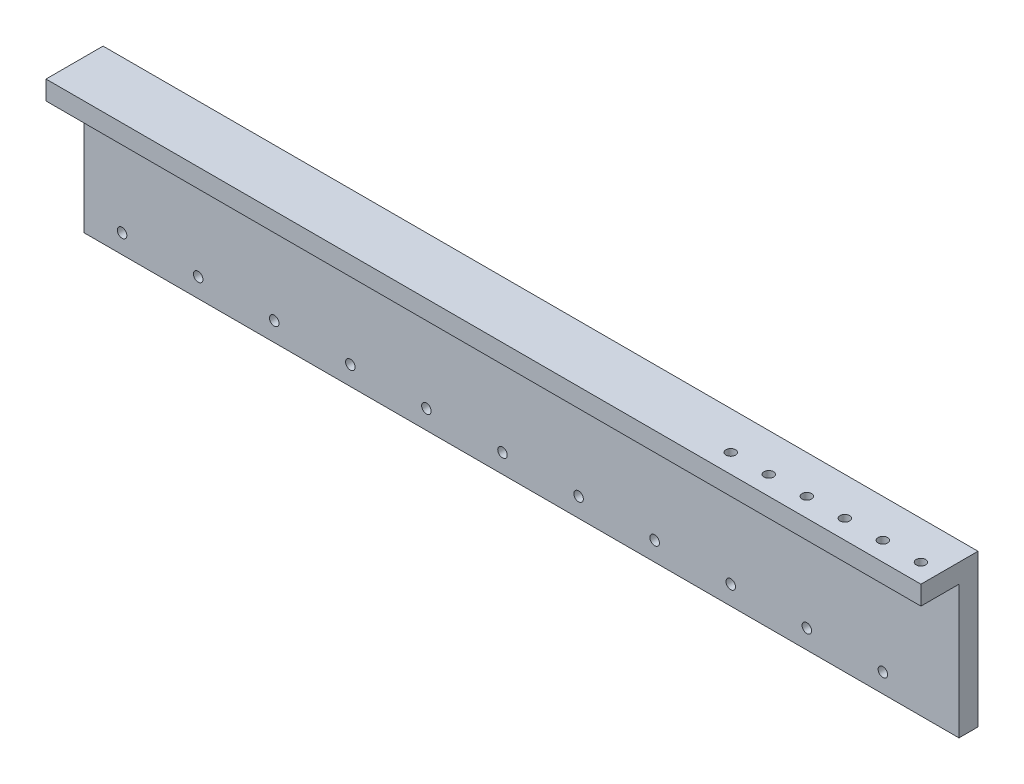
ISO-10303-21;
HEADER;
FILE_DESCRIPTION(('STEP AP214'),'2;1');
FILE_NAME('part.step','',(''),(''),'','','');
FILE_SCHEMA(('AUTOMOTIVE_DESIGN { 1 0 10303 214 1 1 1 1 }'));
ENDSEC;
DATA;
#1=APPLICATION_CONTEXT('core data for automotive mechanical design processes');
#2=APPLICATION_PROTOCOL_DEFINITION('international standard','automotive_design',2000,#1);
#3=PRODUCT_CONTEXT('',#1,'mechanical');
#4=PRODUCT('Part','Part','',(#3));
#5=PRODUCT_RELATED_PRODUCT_CATEGORY('part','',(#4));
#6=PRODUCT_DEFINITION_FORMATION('','',#4);
#7=PRODUCT_DEFINITION_CONTEXT('part definition',#1,'design');
#8=PRODUCT_DEFINITION('design','',#6,#7);
#9=PRODUCT_DEFINITION_SHAPE('','',#8);
#10=(LENGTH_UNIT() NAMED_UNIT(*) SI_UNIT(.MILLI.,.METRE.));
#11=(NAMED_UNIT(*) PLANE_ANGLE_UNIT() SI_UNIT($,.RADIAN.));
#12=(NAMED_UNIT(*) SI_UNIT($,.STERADIAN.) SOLID_ANGLE_UNIT());
#13=UNCERTAINTY_MEASURE_WITH_UNIT(LENGTH_MEASURE(1.E-05),#10,'distance_accuracy_value','');
#14=(GEOMETRIC_REPRESENTATION_CONTEXT(3) GLOBAL_UNCERTAINTY_ASSIGNED_CONTEXT((#13)) GLOBAL_UNIT_ASSIGNED_CONTEXT((#10,
#11,#12)) REPRESENTATION_CONTEXT('',''));
#15=CARTESIAN_POINT('',(0.,0.,0.));
#16=DIRECTION('',(0.,0.,1.));
#17=DIRECTION('',(1.,0.,0.));
#18=AXIS2_PLACEMENT_3D('',#15,#16,#17);
#19=CARTESIAN_POINT('',(0.,0.,5.));
#20=DIRECTION('',(0.,0.,-1.));
#21=DIRECTION('',(-1.,0.,0.));
#22=AXIS2_PLACEMENT_3D('',#19,#20,#21);
#23=PLANE('',#22);
#24=CARTESIAN_POINT('',(95.,-15.,5.));
#25=DIRECTION('',(0.,0.,1.));
#26=DIRECTION('',(1.,0.,0.));
#27=AXIS2_PLACEMENT_3D('',#24,#25,#26);
#28=CIRCLE('',#27,1.25);
#29=CARTESIAN_POINT('',(96.25,-15.,5.));
#30=VERTEX_POINT('',#29);
#31=EDGE_CURVE('E142',#30,#30,#28,.T.);
#32=ORIENTED_EDGE('',*,*,#31,.F.);
#33=EDGE_LOOP('',(#32));
#34=FACE_BOUND('',#33,.T.);
#35=CARTESIAN_POINT('',(75.,-15.,5.));
#36=DIRECTION('',(0.,0.,1.));
#37=DIRECTION('',(1.,0.,0.));
#38=AXIS2_PLACEMENT_3D('',#35,#36,#37);
#39=CIRCLE('',#38,1.25);
#40=CARTESIAN_POINT('',(76.25,-15.,5.));
#41=VERTEX_POINT('',#40);
#42=EDGE_CURVE('E148',#41,#41,#39,.T.);
#43=ORIENTED_EDGE('',*,*,#42,.F.);
#44=EDGE_LOOP('',(#43));
#45=FACE_BOUND('',#44,.T.);
#46=CARTESIAN_POINT('',(55.,-15.,5.));
#47=DIRECTION('',(0.,0.,1.));
#48=DIRECTION('',(1.,0.,0.));
#49=AXIS2_PLACEMENT_3D('',#46,#47,#48);
#50=CIRCLE('',#49,1.25);
#51=CARTESIAN_POINT('',(56.25,-15.,5.));
#52=VERTEX_POINT('',#51);
#53=EDGE_CURVE('E154',#52,#52,#50,.T.);
#54=ORIENTED_EDGE('',*,*,#53,.F.);
#55=EDGE_LOOP('',(#54));
#56=FACE_BOUND('',#55,.T.);
#57=CARTESIAN_POINT('',(35.,-15.,5.));
#58=DIRECTION('',(0.,0.,1.));
#59=DIRECTION('',(1.,0.,0.));
#60=AXIS2_PLACEMENT_3D('',#57,#58,#59);
#61=CIRCLE('',#60,1.25);
#62=CARTESIAN_POINT('',(36.25,-15.,5.));
#63=VERTEX_POINT('',#62);
#64=EDGE_CURVE('E160',#63,#63,#61,.T.);
#65=ORIENTED_EDGE('',*,*,#64,.F.);
#66=EDGE_LOOP('',(#65));
#67=FACE_BOUND('',#66,.T.);
#68=CARTESIAN_POINT('',(15.,-15.,5.));
#69=DIRECTION('',(0.,0.,1.));
#70=DIRECTION('',(1.,0.,0.));
#71=AXIS2_PLACEMENT_3D('',#68,#69,#70);
#72=CIRCLE('',#71,1.25);
#73=CARTESIAN_POINT('',(16.25,-15.,5.));
#74=VERTEX_POINT('',#73);
#75=EDGE_CURVE('E166',#74,#74,#72,.T.);
#76=ORIENTED_EDGE('',*,*,#75,.F.);
#77=EDGE_LOOP('',(#76));
#78=FACE_BOUND('',#77,.T.);
#79=CARTESIAN_POINT('',(-4.99999999999999,-15.,5.));
#80=DIRECTION('',(0.,0.,1.));
#81=DIRECTION('',(1.,0.,0.));
#82=AXIS2_PLACEMENT_3D('',#79,#80,#81);
#83=CIRCLE('',#82,1.25);
#84=CARTESIAN_POINT('',(-3.74999999999999,-15.,5.));
#85=VERTEX_POINT('',#84);
#86=EDGE_CURVE('E172',#85,#85,#83,.T.);
#87=ORIENTED_EDGE('',*,*,#86,.F.);
#88=EDGE_LOOP('',(#87));
#89=FACE_BOUND('',#88,.T.);
#90=CARTESIAN_POINT('',(-25.,-15.,5.));
#91=DIRECTION('',(0.,0.,1.));
#92=DIRECTION('',(1.,0.,0.));
#93=AXIS2_PLACEMENT_3D('',#90,#91,#92);
#94=CIRCLE('',#93,1.25);
#95=CARTESIAN_POINT('',(-23.75,-15.,5.));
#96=VERTEX_POINT('',#95);
#97=EDGE_CURVE('E178',#96,#96,#94,.T.);
#98=ORIENTED_EDGE('',*,*,#97,.F.);
#99=EDGE_LOOP('',(#98));
#100=FACE_BOUND('',#99,.T.);
#101=CARTESIAN_POINT('',(-45.,-15.,5.));
#102=DIRECTION('',(0.,0.,1.));
#103=DIRECTION('',(1.,0.,0.));
#104=AXIS2_PLACEMENT_3D('',#101,#102,#103);
#105=CIRCLE('',#104,1.25);
#106=CARTESIAN_POINT('',(-43.75,-15.,5.));
#107=VERTEX_POINT('',#106);
#108=EDGE_CURVE('E184',#107,#107,#105,.T.);
#109=ORIENTED_EDGE('',*,*,#108,.F.);
#110=EDGE_LOOP('',(#109));
#111=FACE_BOUND('',#110,.T.);
#112=CARTESIAN_POINT('',(-65.,-15.,5.));
#113=DIRECTION('',(0.,0.,1.));
#114=DIRECTION('',(1.,0.,0.));
#115=AXIS2_PLACEMENT_3D('',#112,#113,#114);
#116=CIRCLE('',#115,1.25000000000001);
#117=CARTESIAN_POINT('',(-63.75,-15.,5.));
#118=VERTEX_POINT('',#117);
#119=EDGE_CURVE('E190',#118,#118,#116,.T.);
#120=ORIENTED_EDGE('',*,*,#119,.F.);
#121=EDGE_LOOP('',(#120));
#122=FACE_BOUND('',#121,.T.);
#123=CARTESIAN_POINT('',(-85.,-15.,5.));
#124=DIRECTION('',(0.,0.,1.));
#125=DIRECTION('',(1.,0.,0.));
#126=AXIS2_PLACEMENT_3D('',#123,#124,#125);
#127=CIRCLE('',#126,1.25);
#128=CARTESIAN_POINT('',(-83.75,-15.,5.));
#129=VERTEX_POINT('',#128);
#130=EDGE_CURVE('E196',#129,#129,#127,.T.);
#131=ORIENTED_EDGE('',*,*,#130,.F.);
#132=EDGE_LOOP('',(#131));
#133=FACE_BOUND('',#132,.T.);
#134=CARTESIAN_POINT('',(-105.,-15.,5.));
#135=DIRECTION('',(0.,0.,1.));
#136=DIRECTION('',(1.,0.,0.));
#137=AXIS2_PLACEMENT_3D('',#134,#135,#136);
#138=CIRCLE('',#137,1.25);
#139=CARTESIAN_POINT('',(-103.75,-15.,5.));
#140=VERTEX_POINT('',#139);
#141=EDGE_CURVE('E97',#140,#140,#138,.T.);
#142=ORIENTED_EDGE('',*,*,#141,.F.);
#143=EDGE_LOOP('',(#142));
#144=FACE_BOUND('',#143,.T.);
#145=DIRECTION('',(1.,0.,0.));
#146=VECTOR('',#145,1.);
#147=CARTESIAN_POINT('',(-115.,15.,5.));
#148=LINE('',#147,#146);
#149=CARTESIAN_POINT('',(-115.,15.,5.));
#150=VERTEX_POINT('',#149);
#151=CARTESIAN_POINT('',(115.,15.,5.));
#152=VERTEX_POINT('',#151);
#153=EDGE_CURVE('E50',#150,#152,#148,.T.);
#154=ORIENTED_EDGE('',*,*,#153,.F.);
#155=DIRECTION('',(0.,-1.,0.));
#156=VECTOR('',#155,1.);
#157=CARTESIAN_POINT('',(-115.,-20.,5.));
#158=LINE('',#157,#156);
#159=CARTESIAN_POINT('',(-115.,-20.,5.));
#160=VERTEX_POINT('',#159);
#161=EDGE_CURVE('E203',#150,#160,#158,.T.);
#162=ORIENTED_EDGE('',*,*,#161,.T.);
#163=DIRECTION('',(1.,0.,0.));
#164=VECTOR('',#163,1.);
#165=CARTESIAN_POINT('',(-115.,-20.,5.));
#166=LINE('',#165,#164);
#167=CARTESIAN_POINT('',(115.,-20.,5.));
#168=VERTEX_POINT('',#167);
#169=EDGE_CURVE('E56',#160,#168,#166,.T.);
#170=ORIENTED_EDGE('',*,*,#169,.T.);
#171=DIRECTION('',(0.,1.,0.));
#172=VECTOR('',#171,1.);
#173=CARTESIAN_POINT('',(115.,-20.,5.));
#174=LINE('',#173,#172);
#175=EDGE_CURVE('E85',#168,#152,#174,.T.);
#176=ORIENTED_EDGE('',*,*,#175,.T.);
#177=EDGE_LOOP('',(#154,#162,#170,#176));
#178=FACE_BOUND('',#177,.T.);
#179=ADVANCED_FACE('F35',(#34,#45,#56,#67,#78,#89,#100,#111,#122,#133,#144,#178),#23,.F.);
#180=CARTESIAN_POINT('',(0.,0.,0.));
#181=DIRECTION('',(0.,0.,-1.));
#182=DIRECTION('',(-1.,0.,0.));
#183=AXIS2_PLACEMENT_3D('',#180,#181,#182);
#184=PLANE('',#183);
#185=CARTESIAN_POINT('',(75.,-15.,0.));
#186=DIRECTION('',(0.,0.,1.));
#187=DIRECTION('',(1.,0.,0.));
#188=AXIS2_PLACEMENT_3D('',#185,#186,#187);
#189=CIRCLE('',#188,1.25);
#190=CARTESIAN_POINT('',(76.25,-15.,0.));
#191=VERTEX_POINT('',#190);
#192=EDGE_CURVE('E145',#191,#191,#189,.T.);
#193=ORIENTED_EDGE('',*,*,#192,.T.);
#194=EDGE_LOOP('',(#193));
#195=FACE_BOUND('',#194,.T.);
#196=CARTESIAN_POINT('',(35.,-15.,0.));
#197=DIRECTION('',(0.,0.,1.));
#198=DIRECTION('',(1.,0.,0.));
#199=AXIS2_PLACEMENT_3D('',#196,#197,#198);
#200=CIRCLE('',#199,1.25);
#201=CARTESIAN_POINT('',(36.25,-15.,0.));
#202=VERTEX_POINT('',#201);
#203=EDGE_CURVE('E157',#202,#202,#200,.T.);
#204=ORIENTED_EDGE('',*,*,#203,.T.);
#205=EDGE_LOOP('',(#204));
#206=FACE_BOUND('',#205,.T.);
#207=CARTESIAN_POINT('',(-4.99999999999999,-15.,0.));
#208=DIRECTION('',(0.,0.,1.));
#209=DIRECTION('',(1.,0.,0.));
#210=AXIS2_PLACEMENT_3D('',#207,#208,#209);
#211=CIRCLE('',#210,1.25);
#212=CARTESIAN_POINT('',(-3.74999999999999,-15.,0.));
#213=VERTEX_POINT('',#212);
#214=EDGE_CURVE('E169',#213,#213,#211,.T.);
#215=ORIENTED_EDGE('',*,*,#214,.T.);
#216=EDGE_LOOP('',(#215));
#217=FACE_BOUND('',#216,.T.);
#218=CARTESIAN_POINT('',(-45.,-15.,0.));
#219=DIRECTION('',(0.,0.,1.));
#220=DIRECTION('',(1.,0.,0.));
#221=AXIS2_PLACEMENT_3D('',#218,#219,#220);
#222=CIRCLE('',#221,1.25);
#223=CARTESIAN_POINT('',(-43.75,-15.,0.));
#224=VERTEX_POINT('',#223);
#225=EDGE_CURVE('E181',#224,#224,#222,.T.);
#226=ORIENTED_EDGE('',*,*,#225,.T.);
#227=EDGE_LOOP('',(#226));
#228=FACE_BOUND('',#227,.T.);
#229=CARTESIAN_POINT('',(-85.,-15.,0.));
#230=DIRECTION('',(0.,0.,1.));
#231=DIRECTION('',(1.,0.,0.));
#232=AXIS2_PLACEMENT_3D('',#229,#230,#231);
#233=CIRCLE('',#232,1.25);
#234=CARTESIAN_POINT('',(-83.75,-15.,0.));
#235=VERTEX_POINT('',#234);
#236=EDGE_CURVE('E193',#235,#235,#233,.T.);
#237=ORIENTED_EDGE('',*,*,#236,.T.);
#238=EDGE_LOOP('',(#237));
#239=FACE_BOUND('',#238,.T.);
#240=DIRECTION('',(0.,1.,0.));
#241=VECTOR('',#240,1.);
#242=CARTESIAN_POINT('',(115.,-20.,0.));
#243=LINE('',#242,#241);
#244=CARTESIAN_POINT('',(115.,-20.,0.));
#245=VERTEX_POINT('',#244);
#246=CARTESIAN_POINT('',(115.,20.,0.));
#247=VERTEX_POINT('',#246);
#248=EDGE_CURVE('E91',#245,#247,#243,.T.);
#249=ORIENTED_EDGE('',*,*,#248,.F.);
#250=DIRECTION('',(1.,0.,0.));
#251=VECTOR('',#250,1.);
#252=CARTESIAN_POINT('',(-115.,-20.,0.));
#253=LINE('',#252,#251);
#254=CARTESIAN_POINT('',(-115.,-20.,0.));
#255=VERTEX_POINT('',#254);
#256=EDGE_CURVE('E75',#255,#245,#253,.T.);
#257=ORIENTED_EDGE('',*,*,#256,.F.);
#258=DIRECTION('',(0.,-1.,0.));
#259=VECTOR('',#258,1.);
#260=CARTESIAN_POINT('',(-115.,-20.,0.));
#261=LINE('',#260,#259);
#262=CARTESIAN_POINT('',(-115.,20.,0.));
#263=VERTEX_POINT('',#262);
#264=EDGE_CURVE('E86',#263,#255,#261,.T.);
#265=ORIENTED_EDGE('',*,*,#264,.F.);
#266=DIRECTION('',(-1.,0.,0.));
#267=VECTOR('',#266,1.);
#268=CARTESIAN_POINT('',(-115.,20.,0.));
#269=LINE('',#268,#267);
#270=EDGE_CURVE('E96',#247,#263,#269,.T.);
#271=ORIENTED_EDGE('',*,*,#270,.F.);
#272=EDGE_LOOP('',(#249,#257,#265,#271));
#273=FACE_BOUND('',#272,.T.);
#274=CARTESIAN_POINT('',(-105.,-15.,0.));
#275=DIRECTION('',(0.,0.,1.));
#276=DIRECTION('',(1.,0.,0.));
#277=AXIS2_PLACEMENT_3D('',#274,#275,#276);
#278=CIRCLE('',#277,1.25);
#279=CARTESIAN_POINT('',(-103.75,-15.,0.));
#280=VERTEX_POINT('',#279);
#281=EDGE_CURVE('E101',#280,#280,#278,.T.);
#282=ORIENTED_EDGE('',*,*,#281,.T.);
#283=EDGE_LOOP('',(#282));
#284=FACE_BOUND('',#283,.T.);
#285=CARTESIAN_POINT('',(-65.,-15.,0.));
#286=DIRECTION('',(0.,0.,1.));
#287=DIRECTION('',(1.,0.,0.));
#288=AXIS2_PLACEMENT_3D('',#285,#286,#287);
#289=CIRCLE('',#288,1.25000000000001);
#290=CARTESIAN_POINT('',(-63.75,-15.,0.));
#291=VERTEX_POINT('',#290);
#292=EDGE_CURVE('E187',#291,#291,#289,.T.);
#293=ORIENTED_EDGE('',*,*,#292,.T.);
#294=EDGE_LOOP('',(#293));
#295=FACE_BOUND('',#294,.T.);
#296=CARTESIAN_POINT('',(-25.,-15.,0.));
#297=DIRECTION('',(0.,0.,1.));
#298=DIRECTION('',(1.,0.,0.));
#299=AXIS2_PLACEMENT_3D('',#296,#297,#298);
#300=CIRCLE('',#299,1.25);
#301=CARTESIAN_POINT('',(-23.75,-15.,0.));
#302=VERTEX_POINT('',#301);
#303=EDGE_CURVE('E175',#302,#302,#300,.T.);
#304=ORIENTED_EDGE('',*,*,#303,.T.);
#305=EDGE_LOOP('',(#304));
#306=FACE_BOUND('',#305,.T.);
#307=CARTESIAN_POINT('',(15.,-15.,0.));
#308=DIRECTION('',(0.,0.,1.));
#309=DIRECTION('',(1.,0.,0.));
#310=AXIS2_PLACEMENT_3D('',#307,#308,#309);
#311=CIRCLE('',#310,1.25);
#312=CARTESIAN_POINT('',(16.25,-15.,0.));
#313=VERTEX_POINT('',#312);
#314=EDGE_CURVE('E163',#313,#313,#311,.T.);
#315=ORIENTED_EDGE('',*,*,#314,.T.);
#316=EDGE_LOOP('',(#315));
#317=FACE_BOUND('',#316,.T.);
#318=CARTESIAN_POINT('',(55.,-15.,0.));
#319=DIRECTION('',(0.,0.,1.));
#320=DIRECTION('',(1.,0.,0.));
#321=AXIS2_PLACEMENT_3D('',#318,#319,#320);
#322=CIRCLE('',#321,1.25);
#323=CARTESIAN_POINT('',(56.25,-15.,0.));
#324=VERTEX_POINT('',#323);
#325=EDGE_CURVE('E151',#324,#324,#322,.T.);
#326=ORIENTED_EDGE('',*,*,#325,.T.);
#327=EDGE_LOOP('',(#326));
#328=FACE_BOUND('',#327,.T.);
#329=CARTESIAN_POINT('',(95.,-15.,0.));
#330=DIRECTION('',(0.,0.,1.));
#331=DIRECTION('',(1.,0.,0.));
#332=AXIS2_PLACEMENT_3D('',#329,#330,#331);
#333=CIRCLE('',#332,1.25);
#334=CARTESIAN_POINT('',(96.25,-15.,0.));
#335=VERTEX_POINT('',#334);
#336=EDGE_CURVE('E141',#335,#335,#333,.T.);
#337=ORIENTED_EDGE('',*,*,#336,.T.);
#338=EDGE_LOOP('',(#337));
#339=FACE_BOUND('',#338,.T.);
#340=ADVANCED_FACE('F94',(#195,#206,#217,#228,#239,#273,#284,#295,#306,#317,#328,#339),#184,.T.);
#341=CARTESIAN_POINT('',(115.,-20.,5.));
#342=DIRECTION('',(-1.,0.,0.));
#343=DIRECTION('',(0.,0.,1.));
#344=AXIS2_PLACEMENT_3D('',#341,#342,#343);
#345=PLANE('',#344);
#346=ORIENTED_EDGE('',*,*,#248,.T.);
#347=DIRECTION('',(0.,0.,-1.));
#348=VECTOR('',#347,1.);
#349=CARTESIAN_POINT('',(115.,20.,5.));
#350=LINE('',#349,#348);
#351=CARTESIAN_POINT('',(115.,20.,15.));
#352=VERTEX_POINT('',#351);
#353=EDGE_CURVE('E11',#352,#247,#350,.T.);
#354=ORIENTED_EDGE('',*,*,#353,.F.);
#355=DIRECTION('',(0.,1.,0.));
#356=VECTOR('',#355,1.);
#357=CARTESIAN_POINT('',(115.,20.,15.));
#358=LINE('',#357,#356);
#359=CARTESIAN_POINT('',(115.,15.,15.));
#360=VERTEX_POINT('',#359);
#361=EDGE_CURVE('E128',#360,#352,#358,.T.);
#362=ORIENTED_EDGE('',*,*,#361,.F.);
#363=DIRECTION('',(0.,0.,-1.));
#364=VECTOR('',#363,1.);
#365=CARTESIAN_POINT('',(115.,15.,15.));
#366=LINE('',#365,#364);
#367=EDGE_CURVE('E129',#360,#152,#366,.T.);
#368=ORIENTED_EDGE('',*,*,#367,.T.);
#369=ORIENTED_EDGE('',*,*,#175,.F.);
#370=DIRECTION('',(0.,0.,-1.));
#371=VECTOR('',#370,1.);
#372=CARTESIAN_POINT('',(115.,-20.,5.));
#373=LINE('',#372,#371);
#374=EDGE_CURVE('E78',#168,#245,#373,.T.);
#375=ORIENTED_EDGE('',*,*,#374,.T.);
#376=EDGE_LOOP('',(#346,#354,#362,#368,#369,#375));
#377=FACE_BOUND('',#376,.T.);
#378=ADVANCED_FACE('F37',(#377),#345,.F.);
#379=CARTESIAN_POINT('',(-115.,20.,5.));
#380=DIRECTION('',(0.,-1.,0.));
#381=DIRECTION('',(0.,0.,-1.));
#382=AXIS2_PLACEMENT_3D('',#379,#380,#381);
#383=PLANE('',#382);
#384=CARTESIAN_POINT('',(110.,20.,10.));
#385=DIRECTION('',(0.,1.,0.));
#386=DIRECTION('',(0.,0.,1.));
#387=AXIS2_PLACEMENT_3D('',#384,#385,#386);
#388=CIRCLE('',#387,1.25);
#389=CARTESIAN_POINT('',(110.,20.,11.25));
#390=VERTEX_POINT('',#389);
#391=EDGE_CURVE('E241',#390,#390,#388,.T.);
#392=ORIENTED_EDGE('',*,*,#391,.F.);
#393=EDGE_LOOP('',(#392));
#394=FACE_BOUND('',#393,.T.);
#395=CARTESIAN_POINT('',(100.,20.,10.0000000000001));
#396=DIRECTION('',(0.,1.,0.));
#397=DIRECTION('',(0.,0.,1.));
#398=AXIS2_PLACEMENT_3D('',#395,#396,#397);
#399=CIRCLE('',#398,1.25);
#400=CARTESIAN_POINT('',(100.,20.,11.2500000000001));
#401=VERTEX_POINT('',#400);
#402=EDGE_CURVE('E235',#401,#401,#399,.T.);
#403=ORIENTED_EDGE('',*,*,#402,.F.);
#404=EDGE_LOOP('',(#403));
#405=FACE_BOUND('',#404,.T.);
#406=CARTESIAN_POINT('',(90.,20.,10.0000000000001));
#407=DIRECTION('',(0.,1.,0.));
#408=DIRECTION('',(0.,0.,1.));
#409=AXIS2_PLACEMENT_3D('',#406,#407,#408);
#410=CIRCLE('',#409,1.25);
#411=CARTESIAN_POINT('',(90.,20.,11.2500000000001));
#412=VERTEX_POINT('',#411);
#413=EDGE_CURVE('E229',#412,#412,#410,.T.);
#414=ORIENTED_EDGE('',*,*,#413,.F.);
#415=EDGE_LOOP('',(#414));
#416=FACE_BOUND('',#415,.T.);
#417=CARTESIAN_POINT('',(80.,20.,10.0000000000002));
#418=DIRECTION('',(0.,1.,0.));
#419=DIRECTION('',(0.,0.,1.));
#420=AXIS2_PLACEMENT_3D('',#417,#418,#419);
#421=CIRCLE('',#420,1.25);
#422=CARTESIAN_POINT('',(80.,20.,11.2500000000002));
#423=VERTEX_POINT('',#422);
#424=EDGE_CURVE('E223',#423,#423,#421,.T.);
#425=ORIENTED_EDGE('',*,*,#424,.F.);
#426=EDGE_LOOP('',(#425));
#427=FACE_BOUND('',#426,.T.);
#428=CARTESIAN_POINT('',(70.,20.,10.0000000000003));
#429=DIRECTION('',(0.,1.,0.));
#430=DIRECTION('',(0.,0.,1.));
#431=AXIS2_PLACEMENT_3D('',#428,#429,#430);
#432=CIRCLE('',#431,1.25000000000001);
#433=CARTESIAN_POINT('',(70.,20.,11.2500000000003));
#434=VERTEX_POINT('',#433);
#435=EDGE_CURVE('E216',#434,#434,#432,.T.);
#436=ORIENTED_EDGE('',*,*,#435,.F.);
#437=EDGE_LOOP('',(#436));
#438=FACE_BOUND('',#437,.T.);
#439=CARTESIAN_POINT('',(60.,20.,10.0000000000003));
#440=DIRECTION('',(0.,1.,0.));
#441=DIRECTION('',(0.,0.,1.));
#442=AXIS2_PLACEMENT_3D('',#439,#440,#441);
#443=CIRCLE('',#442,1.25);
#444=CARTESIAN_POINT('',(60.,20.,11.2500000000003));
#445=VERTEX_POINT('',#444);
#446=EDGE_CURVE('E217',#445,#445,#443,.T.);
#447=ORIENTED_EDGE('',*,*,#446,.F.);
#448=EDGE_LOOP('',(#447));
#449=FACE_BOUND('',#448,.T.);
#450=ORIENTED_EDGE('',*,*,#270,.T.);
#451=DIRECTION('',(0.,0.,-1.));
#452=VECTOR('',#451,1.);
#453=CARTESIAN_POINT('',(-115.,20.,5.));
#454=LINE('',#453,#452);
#455=CARTESIAN_POINT('',(-115.,20.,15.));
#456=VERTEX_POINT('',#455);
#457=EDGE_CURVE('E43',#456,#263,#454,.T.);
#458=ORIENTED_EDGE('',*,*,#457,.F.);
#459=DIRECTION('',(-1.,0.,0.));
#460=VECTOR('',#459,1.);
#461=CARTESIAN_POINT('',(-115.,20.,15.));
#462=LINE('',#461,#460);
#463=EDGE_CURVE('E120',#352,#456,#462,.T.);
#464=ORIENTED_EDGE('',*,*,#463,.F.);
#465=ORIENTED_EDGE('',*,*,#353,.T.);
#466=EDGE_LOOP('',(#450,#458,#464,#465));
#467=FACE_BOUND('',#466,.T.);
#468=ADVANCED_FACE('F118',(#394,#405,#416,#427,#438,#449,#467),#383,.F.);
#469=CARTESIAN_POINT('',(-115.,-20.,5.));
#470=DIRECTION('',(1.,0.,0.));
#471=DIRECTION('',(0.,0.,-1.));
#472=AXIS2_PLACEMENT_3D('',#469,#470,#471);
#473=PLANE('',#472);
#474=ORIENTED_EDGE('',*,*,#264,.T.);
#475=DIRECTION('',(0.,0.,-1.));
#476=VECTOR('',#475,1.);
#477=CARTESIAN_POINT('',(-115.,-20.,5.));
#478=LINE('',#477,#476);
#479=EDGE_CURVE('E81',#160,#255,#478,.T.);
#480=ORIENTED_EDGE('',*,*,#479,.F.);
#481=ORIENTED_EDGE('',*,*,#161,.F.);
#482=DIRECTION('',(0.,0.,-1.));
#483=VECTOR('',#482,1.);
#484=CARTESIAN_POINT('',(-115.,15.,15.));
#485=LINE('',#484,#483);
#486=CARTESIAN_POINT('',(-115.,15.,15.));
#487=VERTEX_POINT('',#486);
#488=EDGE_CURVE('E131',#487,#150,#485,.T.);
#489=ORIENTED_EDGE('',*,*,#488,.F.);
#490=DIRECTION('',(0.,-1.,0.));
#491=VECTOR('',#490,1.);
#492=CARTESIAN_POINT('',(-115.,20.,15.));
#493=LINE('',#492,#491);
#494=EDGE_CURVE('E114',#456,#487,#493,.T.);
#495=ORIENTED_EDGE('',*,*,#494,.F.);
#496=ORIENTED_EDGE('',*,*,#457,.T.);
#497=EDGE_LOOP('',(#474,#480,#481,#489,#495,#496));
#498=FACE_BOUND('',#497,.T.);
#499=ADVANCED_FACE('F111',(#498),#473,.F.);
#500=CARTESIAN_POINT('',(-115.,-20.,5.));
#501=DIRECTION('',(0.,1.,0.));
#502=DIRECTION('',(0.,0.,1.));
#503=AXIS2_PLACEMENT_3D('',#500,#501,#502);
#504=PLANE('',#503);
#505=ORIENTED_EDGE('',*,*,#256,.T.);
#506=ORIENTED_EDGE('',*,*,#374,.F.);
#507=ORIENTED_EDGE('',*,*,#169,.F.);
#508=ORIENTED_EDGE('',*,*,#479,.T.);
#509=EDGE_LOOP('',(#505,#506,#507,#508));
#510=FACE_BOUND('',#509,.T.);
#511=ADVANCED_FACE('F77',(#510),#504,.F.);
#512=CARTESIAN_POINT('',(-105.,-15.,5.));
#513=DIRECTION('',(0.,0.,-1.));
#514=DIRECTION('',(-1.,0.,0.));
#515=AXIS2_PLACEMENT_3D('',#512,#513,#514);
#516=CYLINDRICAL_SURFACE('',#515,1.25);
#517=ORIENTED_EDGE('',*,*,#141,.T.);
#518=EDGE_LOOP('',(#517));
#519=FACE_BOUND('',#518,.T.);
#520=ORIENTED_EDGE('',*,*,#281,.F.);
#521=EDGE_LOOP('',(#520));
#522=FACE_BOUND('',#521,.T.);
#523=ADVANCED_FACE('F296',(#519,#522),#516,.F.);
#524=CARTESIAN_POINT('',(-85.,-15.,5.));
#525=DIRECTION('',(0.,0.,-1.));
#526=DIRECTION('',(-1.,0.,0.));
#527=AXIS2_PLACEMENT_3D('',#524,#525,#526);
#528=CYLINDRICAL_SURFACE('',#527,1.25);
#529=ORIENTED_EDGE('',*,*,#130,.T.);
#530=EDGE_LOOP('',(#529));
#531=FACE_BOUND('',#530,.T.);
#532=ORIENTED_EDGE('',*,*,#236,.F.);
#533=EDGE_LOOP('',(#532));
#534=FACE_BOUND('',#533,.T.);
#535=ADVANCED_FACE('F320',(#531,#534),#528,.F.);
#536=CARTESIAN_POINT('',(-65.,-15.,5.));
#537=DIRECTION('',(0.,0.,-1.));
#538=DIRECTION('',(-1.,0.,0.));
#539=AXIS2_PLACEMENT_3D('',#536,#537,#538);
#540=CYLINDRICAL_SURFACE('',#539,1.25000000000001);
#541=ORIENTED_EDGE('',*,*,#119,.T.);
#542=EDGE_LOOP('',(#541));
#543=FACE_BOUND('',#542,.T.);
#544=ORIENTED_EDGE('',*,*,#292,.F.);
#545=EDGE_LOOP('',(#544));
#546=FACE_BOUND('',#545,.T.);
#547=ADVANCED_FACE('F327',(#543,#546),#540,.F.);
#548=CARTESIAN_POINT('',(-45.,-15.,5.));
#549=DIRECTION('',(0.,0.,-1.));
#550=DIRECTION('',(-1.,0.,0.));
#551=AXIS2_PLACEMENT_3D('',#548,#549,#550);
#552=CYLINDRICAL_SURFACE('',#551,1.25);
#553=ORIENTED_EDGE('',*,*,#108,.T.);
#554=EDGE_LOOP('',(#553));
#555=FACE_BOUND('',#554,.T.);
#556=ORIENTED_EDGE('',*,*,#225,.F.);
#557=EDGE_LOOP('',(#556));
#558=FACE_BOUND('',#557,.T.);
#559=ADVANCED_FACE('F334',(#555,#558),#552,.F.);
#560=CARTESIAN_POINT('',(-25.,-15.,5.));
#561=DIRECTION('',(0.,0.,-1.));
#562=DIRECTION('',(-1.,0.,0.));
#563=AXIS2_PLACEMENT_3D('',#560,#561,#562);
#564=CYLINDRICAL_SURFACE('',#563,1.25);
#565=ORIENTED_EDGE('',*,*,#97,.T.);
#566=EDGE_LOOP('',(#565));
#567=FACE_BOUND('',#566,.T.);
#568=ORIENTED_EDGE('',*,*,#303,.F.);
#569=EDGE_LOOP('',(#568));
#570=FACE_BOUND('',#569,.T.);
#571=ADVANCED_FACE('F342',(#567,#570),#564,.F.);
#572=CARTESIAN_POINT('',(-4.99999999999999,-15.,5.));
#573=DIRECTION('',(0.,0.,-1.));
#574=DIRECTION('',(-1.,0.,0.));
#575=AXIS2_PLACEMENT_3D('',#572,#573,#574);
#576=CYLINDRICAL_SURFACE('',#575,1.25);
#577=ORIENTED_EDGE('',*,*,#86,.T.);
#578=EDGE_LOOP('',(#577));
#579=FACE_BOUND('',#578,.T.);
#580=ORIENTED_EDGE('',*,*,#214,.F.);
#581=EDGE_LOOP('',(#580));
#582=FACE_BOUND('',#581,.T.);
#583=ADVANCED_FACE('F350',(#579,#582),#576,.F.);
#584=CARTESIAN_POINT('',(15.,-15.,5.));
#585=DIRECTION('',(0.,0.,-1.));
#586=DIRECTION('',(-1.,0.,0.));
#587=AXIS2_PLACEMENT_3D('',#584,#585,#586);
#588=CYLINDRICAL_SURFACE('',#587,1.25);
#589=ORIENTED_EDGE('',*,*,#75,.T.);
#590=EDGE_LOOP('',(#589));
#591=FACE_BOUND('',#590,.T.);
#592=ORIENTED_EDGE('',*,*,#314,.F.);
#593=EDGE_LOOP('',(#592));
#594=FACE_BOUND('',#593,.T.);
#595=ADVANCED_FACE('F358',(#591,#594),#588,.F.);
#596=CARTESIAN_POINT('',(35.,-15.,5.));
#597=DIRECTION('',(0.,0.,-1.));
#598=DIRECTION('',(-1.,0.,0.));
#599=AXIS2_PLACEMENT_3D('',#596,#597,#598);
#600=CYLINDRICAL_SURFACE('',#599,1.25);
#601=ORIENTED_EDGE('',*,*,#64,.T.);
#602=EDGE_LOOP('',(#601));
#603=FACE_BOUND('',#602,.T.);
#604=ORIENTED_EDGE('',*,*,#203,.F.);
#605=EDGE_LOOP('',(#604));
#606=FACE_BOUND('',#605,.T.);
#607=ADVANCED_FACE('F366',(#603,#606),#600,.F.);
#608=CARTESIAN_POINT('',(55.,-15.,5.));
#609=DIRECTION('',(0.,0.,-1.));
#610=DIRECTION('',(-1.,0.,0.));
#611=AXIS2_PLACEMENT_3D('',#608,#609,#610);
#612=CYLINDRICAL_SURFACE('',#611,1.25);
#613=ORIENTED_EDGE('',*,*,#53,.T.);
#614=EDGE_LOOP('',(#613));
#615=FACE_BOUND('',#614,.T.);
#616=ORIENTED_EDGE('',*,*,#325,.F.);
#617=EDGE_LOOP('',(#616));
#618=FACE_BOUND('',#617,.T.);
#619=ADVANCED_FACE('F374',(#615,#618),#612,.F.);
#620=CARTESIAN_POINT('',(75.,-15.,5.));
#621=DIRECTION('',(0.,0.,-1.));
#622=DIRECTION('',(-1.,0.,0.));
#623=AXIS2_PLACEMENT_3D('',#620,#621,#622);
#624=CYLINDRICAL_SURFACE('',#623,1.25);
#625=ORIENTED_EDGE('',*,*,#42,.T.);
#626=EDGE_LOOP('',(#625));
#627=FACE_BOUND('',#626,.T.);
#628=ORIENTED_EDGE('',*,*,#192,.F.);
#629=EDGE_LOOP('',(#628));
#630=FACE_BOUND('',#629,.T.);
#631=ADVANCED_FACE('F280',(#627,#630),#624,.F.);
#632=CARTESIAN_POINT('',(95.,-15.,5.));
#633=DIRECTION('',(0.,0.,-1.));
#634=DIRECTION('',(-1.,0.,0.));
#635=AXIS2_PLACEMENT_3D('',#632,#633,#634);
#636=CYLINDRICAL_SURFACE('',#635,1.25);
#637=ORIENTED_EDGE('',*,*,#31,.T.);
#638=EDGE_LOOP('',(#637));
#639=FACE_BOUND('',#638,.T.);
#640=ORIENTED_EDGE('',*,*,#336,.F.);
#641=EDGE_LOOP('',(#640));
#642=FACE_BOUND('',#641,.T.);
#643=ADVANCED_FACE('F272',(#639,#642),#636,.F.);
#644=CARTESIAN_POINT('',(-115.,15.,15.));
#645=DIRECTION('',(0.,1.,0.));
#646=DIRECTION('',(-1.,0.,0.));
#647=AXIS2_PLACEMENT_3D('',#644,#645,#646);
#648=PLANE('',#647);
#649=CARTESIAN_POINT('',(110.,15.,10.));
#650=DIRECTION('',(0.,1.,0.));
#651=DIRECTION('',(-1.,0.,0.));
#652=AXIS2_PLACEMENT_3D('',#649,#650,#651);
#653=CIRCLE('',#652,1.25);
#654=CARTESIAN_POINT('',(108.75,15.,10.));
#655=VERTEX_POINT('',#654);
#656=EDGE_CURVE('E137',#655,#655,#653,.F.);
#657=ORIENTED_EDGE('',*,*,#656,.F.);
#658=EDGE_LOOP('',(#657));
#659=FACE_BOUND('',#658,.T.);
#660=CARTESIAN_POINT('',(100.,15.,10.0000000000001));
#661=DIRECTION('',(0.,1.,0.));
#662=DIRECTION('',(-1.,0.,0.));
#663=AXIS2_PLACEMENT_3D('',#660,#661,#662);
#664=CIRCLE('',#663,1.25);
#665=CARTESIAN_POINT('',(98.75,15.,10.0000000000001));
#666=VERTEX_POINT('',#665);
#667=EDGE_CURVE('E238',#666,#666,#664,.F.);
#668=ORIENTED_EDGE('',*,*,#667,.F.);
#669=EDGE_LOOP('',(#668));
#670=FACE_BOUND('',#669,.T.);
#671=CARTESIAN_POINT('',(90.,15.,10.0000000000001));
#672=DIRECTION('',(0.,1.,0.));
#673=DIRECTION('',(-1.,0.,0.));
#674=AXIS2_PLACEMENT_3D('',#671,#672,#673);
#675=CIRCLE('',#674,1.25);
#676=CARTESIAN_POINT('',(88.75,15.,10.0000000000001));
#677=VERTEX_POINT('',#676);
#678=EDGE_CURVE('E232',#677,#677,#675,.F.);
#679=ORIENTED_EDGE('',*,*,#678,.F.);
#680=EDGE_LOOP('',(#679));
#681=FACE_BOUND('',#680,.T.);
#682=CARTESIAN_POINT('',(80.,15.,10.0000000000002));
#683=DIRECTION('',(0.,1.,0.));
#684=DIRECTION('',(-1.,0.,0.));
#685=AXIS2_PLACEMENT_3D('',#682,#683,#684);
#686=CIRCLE('',#685,1.25);
#687=CARTESIAN_POINT('',(78.75,15.,10.0000000000002));
#688=VERTEX_POINT('',#687);
#689=EDGE_CURVE('E226',#688,#688,#686,.F.);
#690=ORIENTED_EDGE('',*,*,#689,.F.);
#691=EDGE_LOOP('',(#690));
#692=FACE_BOUND('',#691,.T.);
#693=CARTESIAN_POINT('',(70.,15.,10.0000000000003));
#694=DIRECTION('',(0.,1.,0.));
#695=DIRECTION('',(-1.,0.,0.));
#696=AXIS2_PLACEMENT_3D('',#693,#694,#695);
#697=CIRCLE('',#696,1.25000000000001);
#698=CARTESIAN_POINT('',(68.75,15.,10.0000000000003));
#699=VERTEX_POINT('',#698);
#700=EDGE_CURVE('E220',#699,#699,#697,.F.);
#701=ORIENTED_EDGE('',*,*,#700,.F.);
#702=EDGE_LOOP('',(#701));
#703=FACE_BOUND('',#702,.T.);
#704=CARTESIAN_POINT('',(60.,15.,10.0000000000003));
#705=DIRECTION('',(0.,1.,0.));
#706=DIRECTION('',(-1.,0.,0.));
#707=AXIS2_PLACEMENT_3D('',#704,#705,#706);
#708=CIRCLE('',#707,1.25);
#709=CARTESIAN_POINT('',(58.75,15.,10.0000000000003));
#710=VERTEX_POINT('',#709);
#711=EDGE_CURVE('E213',#710,#710,#708,.F.);
#712=ORIENTED_EDGE('',*,*,#711,.F.);
#713=EDGE_LOOP('',(#712));
#714=FACE_BOUND('',#713,.T.);
#715=ORIENTED_EDGE('',*,*,#153,.T.);
#716=ORIENTED_EDGE('',*,*,#367,.F.);
#717=DIRECTION('',(1.,0.,0.));
#718=VECTOR('',#717,1.);
#719=CARTESIAN_POINT('',(-115.,15.,15.));
#720=LINE('',#719,#718);
#721=EDGE_CURVE('E133',#487,#360,#720,.T.);
#722=ORIENTED_EDGE('',*,*,#721,.F.);
#723=ORIENTED_EDGE('',*,*,#488,.T.);
#724=EDGE_LOOP('',(#715,#716,#722,#723));
#725=FACE_BOUND('',#724,.T.);
#726=ADVANCED_FACE('F206',(#659,#670,#681,#692,#703,#714,#725),#648,.F.);
#727=CARTESIAN_POINT('',(0.,0.,15.));
#728=DIRECTION('',(0.,0.,1.));
#729=DIRECTION('',(1.,0.,0.));
#730=AXIS2_PLACEMENT_3D('',#727,#728,#729);
#731=PLANE('',#730);
#732=ORIENTED_EDGE('',*,*,#494,.T.);
#733=ORIENTED_EDGE('',*,*,#721,.T.);
#734=ORIENTED_EDGE('',*,*,#361,.T.);
#735=ORIENTED_EDGE('',*,*,#463,.T.);
#736=EDGE_LOOP('',(#732,#733,#734,#735));
#737=FACE_BOUND('',#736,.T.);
#738=ADVANCED_FACE('F124',(#737),#731,.T.);
#739=CARTESIAN_POINT('',(60.,-20.001,10.0000000000003));
#740=DIRECTION('',(0.,1.,0.));
#741=DIRECTION('',(0.,0.,1.));
#742=AXIS2_PLACEMENT_3D('',#739,#740,#741);
#743=CYLINDRICAL_SURFACE('',#742,1.25);
#744=ORIENTED_EDGE('',*,*,#446,.T.);
#745=EDGE_LOOP('',(#744));
#746=FACE_BOUND('',#745,.T.);
#747=ORIENTED_EDGE('',*,*,#711,.T.);
#748=EDGE_LOOP('',(#747));
#749=FACE_BOUND('',#748,.T.);
#750=ADVANCED_FACE('F264',(#746,#749),#743,.F.);
#751=CARTESIAN_POINT('',(70.,-20.001,10.0000000000003));
#752=DIRECTION('',(0.,1.,0.));
#753=DIRECTION('',(0.,0.,1.));
#754=AXIS2_PLACEMENT_3D('',#751,#752,#753);
#755=CYLINDRICAL_SURFACE('',#754,1.25000000000001);
#756=ORIENTED_EDGE('',*,*,#435,.T.);
#757=EDGE_LOOP('',(#756));
#758=FACE_BOUND('',#757,.T.);
#759=ORIENTED_EDGE('',*,*,#700,.T.);
#760=EDGE_LOOP('',(#759));
#761=FACE_BOUND('',#760,.T.);
#762=ADVANCED_FACE('F267',(#758,#761),#755,.F.);
#763=CARTESIAN_POINT('',(80.,-20.001,10.0000000000002));
#764=DIRECTION('',(0.,1.,0.));
#765=DIRECTION('',(0.,0.,1.));
#766=AXIS2_PLACEMENT_3D('',#763,#764,#765);
#767=CYLINDRICAL_SURFACE('',#766,1.25);
#768=ORIENTED_EDGE('',*,*,#424,.T.);
#769=EDGE_LOOP('',(#768));
#770=FACE_BOUND('',#769,.T.);
#771=ORIENTED_EDGE('',*,*,#689,.T.);
#772=EDGE_LOOP('',(#771));
#773=FACE_BOUND('',#772,.T.);
#774=ADVANCED_FACE('F467',(#770,#773),#767,.F.);
#775=CARTESIAN_POINT('',(90.,-20.001,10.0000000000001));
#776=DIRECTION('',(0.,1.,0.));
#777=DIRECTION('',(0.,0.,1.));
#778=AXIS2_PLACEMENT_3D('',#775,#776,#777);
#779=CYLINDRICAL_SURFACE('',#778,1.25);
#780=ORIENTED_EDGE('',*,*,#413,.T.);
#781=EDGE_LOOP('',(#780));
#782=FACE_BOUND('',#781,.T.);
#783=ORIENTED_EDGE('',*,*,#678,.T.);
#784=EDGE_LOOP('',(#783));
#785=FACE_BOUND('',#784,.T.);
#786=ADVANCED_FACE('F476',(#782,#785),#779,.F.);
#787=CARTESIAN_POINT('',(100.,-20.001,10.0000000000001));
#788=DIRECTION('',(0.,1.,0.));
#789=DIRECTION('',(0.,0.,1.));
#790=AXIS2_PLACEMENT_3D('',#787,#788,#789);
#791=CYLINDRICAL_SURFACE('',#790,1.25);
#792=ORIENTED_EDGE('',*,*,#402,.T.);
#793=EDGE_LOOP('',(#792));
#794=FACE_BOUND('',#793,.T.);
#795=ORIENTED_EDGE('',*,*,#667,.T.);
#796=EDGE_LOOP('',(#795));
#797=FACE_BOUND('',#796,.T.);
#798=ADVANCED_FACE('F485',(#794,#797),#791,.F.);
#799=CARTESIAN_POINT('',(110.,-20.001,10.));
#800=DIRECTION('',(0.,1.,0.));
#801=DIRECTION('',(0.,0.,1.));
#802=AXIS2_PLACEMENT_3D('',#799,#800,#801);
#803=CYLINDRICAL_SURFACE('',#802,1.25);
#804=ORIENTED_EDGE('',*,*,#391,.T.);
#805=EDGE_LOOP('',(#804));
#806=FACE_BOUND('',#805,.T.);
#807=ORIENTED_EDGE('',*,*,#656,.T.);
#808=EDGE_LOOP('',(#807));
#809=FACE_BOUND('',#808,.T.);
#810=ADVANCED_FACE('F249',(#806,#809),#803,.F.);
#811=CLOSED_SHELL('',(#179,#340,#378,#468,#499,#511,#523,#535,#547,#559,#571,#583,#595,#607,
#619,#631,#643,#726,#738,#750,#762,#774,#786,#798,#810));
#812=MANIFOLD_SOLID_BREP('B2',#811);
#813=ADVANCED_BREP_SHAPE_REPRESENTATION('',(#18,#812),#14);
#814=SHAPE_DEFINITION_REPRESENTATION(#9,#813);
ENDSEC;
END-ISO-10303-21;
